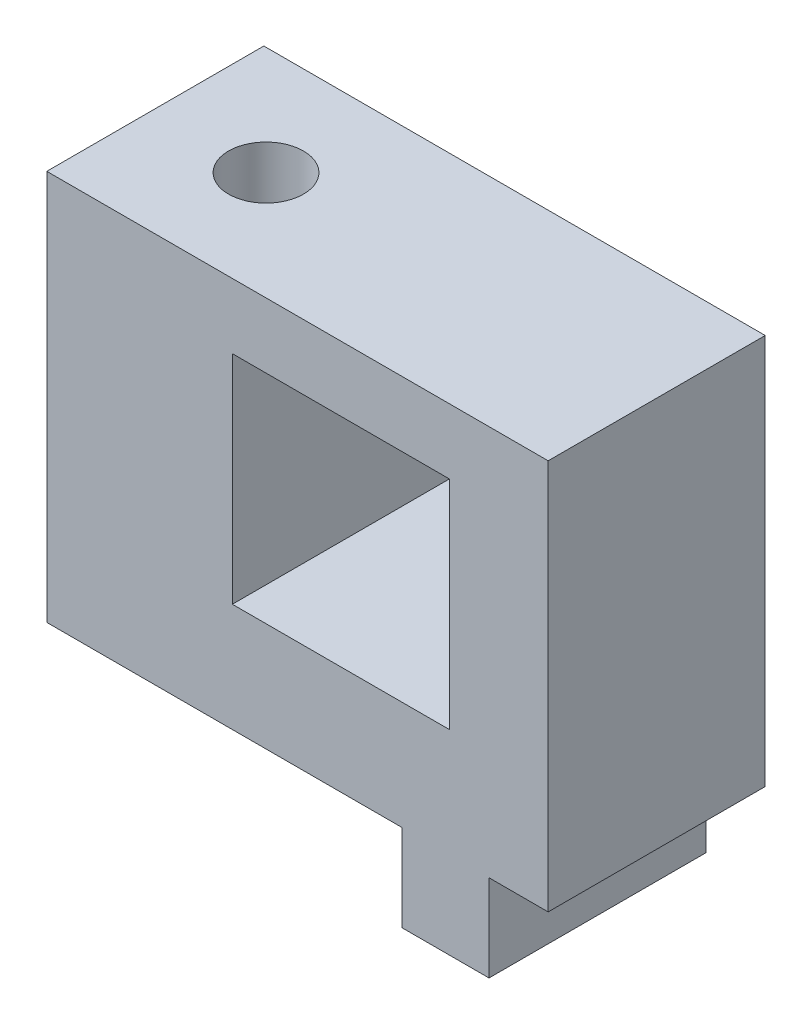
ISO-10303-21;
HEADER;
FILE_DESCRIPTION(('STEP AP214'),'2;1');
FILE_NAME('part.step','',(''),(''),'','','');
FILE_SCHEMA(('AUTOMOTIVE_DESIGN { 1 0 10303 214 1 1 1 1 }'));
ENDSEC;
DATA;
#1=APPLICATION_CONTEXT('core data for automotive mechanical design processes');
#2=APPLICATION_PROTOCOL_DEFINITION('international standard','automotive_design',2000,#1);
#3=PRODUCT_CONTEXT('',#1,'mechanical');
#4=PRODUCT('Part','Part','',(#3));
#5=PRODUCT_RELATED_PRODUCT_CATEGORY('part','',(#4));
#6=PRODUCT_DEFINITION_FORMATION('','',#4);
#7=PRODUCT_DEFINITION_CONTEXT('part definition',#1,'design');
#8=PRODUCT_DEFINITION('design','',#6,#7);
#9=PRODUCT_DEFINITION_SHAPE('','',#8);
#10=(LENGTH_UNIT() NAMED_UNIT(*) SI_UNIT(.MILLI.,.METRE.));
#11=(NAMED_UNIT(*) PLANE_ANGLE_UNIT() SI_UNIT($,.RADIAN.));
#12=(NAMED_UNIT(*) SI_UNIT($,.STERADIAN.) SOLID_ANGLE_UNIT());
#13=UNCERTAINTY_MEASURE_WITH_UNIT(LENGTH_MEASURE(1.E-05),#10,'distance_accuracy_value','');
#14=(GEOMETRIC_REPRESENTATION_CONTEXT(3) GLOBAL_UNCERTAINTY_ASSIGNED_CONTEXT((#13)) GLOBAL_UNIT_ASSIGNED_CONTEXT((#10,
#11,#12)) REPRESENTATION_CONTEXT('',''));
#15=CARTESIAN_POINT('',(0.,0.,0.));
#16=DIRECTION('',(0.,0.,1.));
#17=DIRECTION('',(1.,0.,0.));
#18=AXIS2_PLACEMENT_3D('',#15,#16,#17);
#19=CARTESIAN_POINT('',(64.7817724493501,-48.7352540953182,331.800000190735));
#20=DIRECTION('',(1.,0.,0.));
#21=DIRECTION('',(0.,1.,0.));
#22=AXIS2_PLACEMENT_3D('',#19,#20,#21);
#23=PLANE('',#22);
#24=DIRECTION('',(0.,0.,1.));
#25=VECTOR('',#24,1.);
#26=CARTESIAN_POINT('',(64.7817724493499,-46.8352426512264,331.800000190735));
#27=LINE('',#26,#25);
#28=CARTESIAN_POINT('',(64.7817724493501,-46.8352426512264,326.800000190735));
#29=VERTEX_POINT('',#28);
#30=CARTESIAN_POINT('',(64.7817724493501,-46.8352350218319,336.800000190735));
#31=VERTEX_POINT('',#30);
#32=EDGE_CURVE('E144',#29,#31,#27,.T.);
#33=ORIENTED_EDGE('',*,*,#32,.F.);
#34=DIRECTION('',(0.,1.,0.));
#35=VECTOR('',#34,1.);
#36=CARTESIAN_POINT('',(64.7817724493501,-46.535244558575,326.800000190735));
#37=LINE('',#36,#35);
#38=CARTESIAN_POINT('',(64.7817724493501,-50.8352540953182,326.800000190735));
#39=VERTEX_POINT('',#38);
#40=EDGE_CURVE('E35',#39,#29,#37,.T.);
#41=ORIENTED_EDGE('',*,*,#40,.F.);
#42=DIRECTION('',(0.,0.,-1.));
#43=VECTOR('',#42,1.);
#44=CARTESIAN_POINT('',(64.7817724493502,-50.8352540953182,331.800000190735));
#45=LINE('',#44,#43);
#46=CARTESIAN_POINT('',(64.7817724493501,-50.8352540953182,336.800000190735));
#47=VERTEX_POINT('',#46);
#48=EDGE_CURVE('E217',#47,#39,#45,.T.);
#49=ORIENTED_EDGE('',*,*,#48,.F.);
#50=DIRECTION('',(0.,1.,0.));
#51=VECTOR('',#50,1.);
#52=CARTESIAN_POINT('',(64.7817724493501,-46.535244558575,336.800000190735));
#53=LINE('',#52,#51);
#54=EDGE_CURVE('E11',#47,#31,#53,.T.);
#55=ORIENTED_EDGE('',*,*,#54,.T.);
#56=EDGE_LOOP('',(#33,#41,#49,#55));
#57=FACE_BOUND('',#56,.T.);
#58=ADVANCED_FACE('F16',(#57),#23,.F.);
#59=CARTESIAN_POINT('',(68.7817724493501,-48.7352540953182,331.800000190735));
#60=DIRECTION('',(-1.,0.,0.));
#61=DIRECTION('',(0.,-1.,0.));
#62=AXIS2_PLACEMENT_3D('',#59,#60,#61);
#63=PLANE('',#62);
#64=DIRECTION('',(0.,0.,-1.));
#65=VECTOR('',#64,1.);
#66=CARTESIAN_POINT('',(68.7817724493503,-46.8352426512264,331.800000190735));
#67=LINE('',#66,#65);
#68=CARTESIAN_POINT('',(68.7817724493501,-46.8352350218319,336.800000190735));
#69=VERTEX_POINT('',#68);
#70=CARTESIAN_POINT('',(68.7817724493501,-46.8352426512264,326.800000190735));
#71=VERTEX_POINT('',#70);
#72=EDGE_CURVE('E157',#69,#71,#67,.T.);
#73=ORIENTED_EDGE('',*,*,#72,.F.);
#74=DIRECTION('',(0.,1.,0.));
#75=VECTOR('',#74,1.);
#76=CARTESIAN_POINT('',(68.7817724493501,-46.535244558575,336.800000190735));
#77=LINE('',#76,#75);
#78=CARTESIAN_POINT('',(68.7817724493501,-50.8352540953182,336.800000190735));
#79=VERTEX_POINT('',#78);
#80=EDGE_CURVE('E141',#79,#69,#77,.T.);
#81=ORIENTED_EDGE('',*,*,#80,.F.);
#82=DIRECTION('',(0.,0.,1.));
#83=VECTOR('',#82,1.);
#84=CARTESIAN_POINT('',(68.78177244935,-50.8352540953182,331.800000190735));
#85=LINE('',#84,#83);
#86=CARTESIAN_POINT('',(68.7817724493501,-50.8352540953182,326.800000190735));
#87=VERTEX_POINT('',#86);
#88=EDGE_CURVE('E140',#87,#79,#85,.T.);
#89=ORIENTED_EDGE('',*,*,#88,.F.);
#90=DIRECTION('',(0.,1.,0.));
#91=VECTOR('',#90,1.);
#92=CARTESIAN_POINT('',(68.7817724493501,-46.535244558575,326.800000190735));
#93=LINE('',#92,#91);
#94=EDGE_CURVE('E26',#87,#71,#93,.T.);
#95=ORIENTED_EDGE('',*,*,#94,.T.);
#96=EDGE_LOOP('',(#73,#81,#89,#95));
#97=FACE_BOUND('',#96,.T.);
#98=ADVANCED_FACE('F230',(#97),#63,.F.);
#99=CARTESIAN_POINT('',(65.5067724493501,-50.8352540953182,331.800000190735));
#100=DIRECTION('',(0.,-1.,0.));
#101=DIRECTION('',(0.,0.,1.));
#102=AXIS2_PLACEMENT_3D('',#99,#100,#101);
#103=PLANE('',#102);
#104=DIRECTION('',(-1.,0.,0.));
#105=VECTOR('',#104,1.);
#106=CARTESIAN_POINT('',(65.5067724493501,-50.8352540953182,336.800000190735));
#107=LINE('',#106,#105);
#108=EDGE_CURVE('E210',#79,#47,#107,.T.);
#109=ORIENTED_EDGE('',*,*,#108,.T.);
#110=ORIENTED_EDGE('',*,*,#48,.T.);
#111=DIRECTION('',(1.,0.,0.));
#112=VECTOR('',#111,1.);
#113=CARTESIAN_POINT('',(65.5067724493501,-50.8352540953182,326.800000190735));
#114=LINE('',#113,#112);
#115=EDGE_CURVE('E208',#39,#87,#114,.T.);
#116=ORIENTED_EDGE('',*,*,#115,.T.);
#117=ORIENTED_EDGE('',*,*,#88,.T.);
#118=EDGE_LOOP('',(#109,#110,#116,#117));
#119=FACE_BOUND('',#118,.T.);
#120=ADVANCED_FACE('F216',(#119),#103,.T.);
#121=CARTESIAN_POINT('',(62.006764290576,-44.3352350218319,336.800000190735));
#122=DIRECTION('',(0.,0.,-1.));
#123=DIRECTION('',(0.,-1.,0.));
#124=AXIS2_PLACEMENT_3D('',#121,#122,#123);
#125=PLANE('',#124);
#126=DIRECTION('',(-1.,0.,0.));
#127=VECTOR('',#126,1.);
#128=CARTESIAN_POINT('',(62.006764290576,-46.8352350218319,336.800000190735));
#129=LINE('',#128,#127);
#130=CARTESIAN_POINT('',(71.5067724493502,-46.8352426512264,336.800000190735));
#131=VERTEX_POINT('',#130);
#132=EDGE_CURVE('E134',#131,#69,#129,.T.);
#133=ORIENTED_EDGE('',*,*,#132,.F.);
#134=DIRECTION('',(0.,-1.,0.));
#135=VECTOR('',#134,1.);
#136=CARTESIAN_POINT('',(71.5067724493502,-44.3352350218319,336.800000190735));
#137=LINE('',#136,#135);
#138=CARTESIAN_POINT('',(71.5067724493502,-28.8352159483455,336.800000190735));
#139=VERTEX_POINT('',#138);
#140=EDGE_CURVE('E128',#139,#131,#137,.T.);
#141=ORIENTED_EDGE('',*,*,#140,.F.);
#142=DIRECTION('',(1.,0.,0.));
#143=VECTOR('',#142,1.);
#144=CARTESIAN_POINT('',(62.006764290576,-28.8352159483455,336.800000190735));
#145=LINE('',#144,#143);
#146=CARTESIAN_POINT('',(48.406764290576,-28.8352159483455,336.800000190735));
#147=VERTEX_POINT('',#146);
#148=EDGE_CURVE('E127',#147,#139,#145,.T.);
#149=ORIENTED_EDGE('',*,*,#148,.F.);
#150=DIRECTION('',(0.,-1.,0.));
#151=VECTOR('',#150,1.);
#152=CARTESIAN_POINT('',(48.406764290576,-44.3352350218318,336.800000190735));
#153=LINE('',#152,#151);
#154=CARTESIAN_POINT('',(48.406764290576,-46.8352350218318,336.800000190735));
#155=VERTEX_POINT('',#154);
#156=EDGE_CURVE('E137',#147,#155,#153,.T.);
#157=ORIENTED_EDGE('',*,*,#156,.T.);
#158=DIRECTION('',(-1.,0.,0.));
#159=VECTOR('',#158,1.);
#160=CARTESIAN_POINT('',(62.006764290576,-46.8352350218319,336.800000190735));
#161=LINE('',#160,#159);
#162=EDGE_CURVE('E142',#31,#155,#161,.T.);
#163=ORIENTED_EDGE('',*,*,#162,.F.);
#164=ORIENTED_EDGE('',*,*,#54,.F.);
#165=ORIENTED_EDGE('',*,*,#108,.F.);
#166=ORIENTED_EDGE('',*,*,#80,.T.);
#167=EDGE_LOOP('',(#133,#141,#149,#157,#163,#164,#165,#166));
#168=FACE_BOUND('',#167,.T.);
#169=DIRECTION('',(0.,1.,0.));
#170=VECTOR('',#169,1.);
#171=CARTESIAN_POINT('',(56.9567642905759,-40.5852350218319,336.800000190735));
#172=LINE('',#171,#170);
#173=CARTESIAN_POINT('',(56.9567642905759,-41.8352350218319,336.800000190735));
#174=VERTEX_POINT('',#173);
#175=CARTESIAN_POINT('',(56.9567642905759,-31.8352350218319,336.800000190735));
#176=VERTEX_POINT('',#175);
#177=EDGE_CURVE('E146',#174,#176,#172,.T.);
#178=ORIENTED_EDGE('',*,*,#177,.T.);
#179=DIRECTION('',(1.,0.,0.));
#180=VECTOR('',#179,1.);
#181=CARTESIAN_POINT('',(61.9817642905759,-31.8352350218319,336.800000190735));
#182=LINE('',#181,#180);
#183=CARTESIAN_POINT('',(66.9567642905759,-31.8352350218319,336.800000190735));
#184=VERTEX_POINT('',#183);
#185=EDGE_CURVE('E149',#176,#184,#182,.T.);
#186=ORIENTED_EDGE('',*,*,#185,.T.);
#187=DIRECTION('',(0.,-1.,0.));
#188=VECTOR('',#187,1.);
#189=CARTESIAN_POINT('',(66.9567642905759,-40.5852350218319,336.800000190735));
#190=LINE('',#189,#188);
#191=CARTESIAN_POINT('',(66.9567642905759,-41.8352350218319,336.800000190735));
#192=VERTEX_POINT('',#191);
#193=EDGE_CURVE('E152',#184,#192,#190,.T.);
#194=ORIENTED_EDGE('',*,*,#193,.T.);
#195=DIRECTION('',(-1.,0.,0.));
#196=VECTOR('',#195,1.);
#197=CARTESIAN_POINT('',(61.9817642905759,-41.8352350218319,336.800000190735));
#198=LINE('',#197,#196);
#199=EDGE_CURVE('E155',#192,#174,#198,.T.);
#200=ORIENTED_EDGE('',*,*,#199,.T.);
#201=EDGE_LOOP('',(#178,#186,#194,#200));
#202=FACE_BOUND('',#201,.T.);
#203=ADVANCED_FACE('F197',(#168,#202),#125,.F.);
#204=CARTESIAN_POINT('',(69.0067642905761,-46.8352426512264,331.800000190735));
#205=DIRECTION('',(0.,-1.,0.));
#206=DIRECTION('',(0.,0.,1.));
#207=AXIS2_PLACEMENT_3D('',#204,#205,#206);
#208=PLANE('',#207);
#209=ORIENTED_EDGE('',*,*,#72,.T.);
#210=DIRECTION('',(1.,0.,0.));
#211=VECTOR('',#210,1.);
#212=CARTESIAN_POINT('',(65.5067642905761,-46.8352426512264,326.800000190735));
#213=LINE('',#212,#211);
#214=CARTESIAN_POINT('',(71.5067724493502,-46.8352426512264,326.800000190735));
#215=VERTEX_POINT('',#214);
#216=EDGE_CURVE('E158',#71,#215,#213,.T.);
#217=ORIENTED_EDGE('',*,*,#216,.T.);
#218=DIRECTION('',(0.,0.,1.));
#219=VECTOR('',#218,1.);
#220=CARTESIAN_POINT('',(71.5067724493502,-46.8352426512264,331.800000190735));
#221=LINE('',#220,#219);
#222=EDGE_CURVE('E121',#215,#131,#221,.T.);
#223=ORIENTED_EDGE('',*,*,#222,.T.);
#224=ORIENTED_EDGE('',*,*,#132,.T.);
#225=EDGE_LOOP('',(#209,#217,#223,#224));
#226=FACE_BOUND('',#225,.T.);
#227=ADVANCED_FACE('F204',(#226),#208,.T.);
#228=CARTESIAN_POINT('',(53.5067642905759,-45.8352540953182,331.800000190735));
#229=DIRECTION('',(0.,1.,0.));
#230=DIRECTION('',(0.,0.,-1.));
#231=AXIS2_PLACEMENT_3D('',#228,#229,#230);
#232=CYLINDRICAL_SURFACE('',#231,1.725);
#233=CARTESIAN_POINT('',(53.506764290576,-28.8352159483455,331.800000190735));
#234=DIRECTION('',(0.,-1.,0.));
#235=DIRECTION('',(0.,0.,-1.));
#236=AXIS2_PLACEMENT_3D('',#233,#234,#235);
#237=CIRCLE('',#236,1.725);
#238=CARTESIAN_POINT('',(53.506764290576,-28.8352159483455,330.075000190735));
#239=VERTEX_POINT('',#238);
#240=EDGE_CURVE('E114',#239,#239,#237,.T.);
#241=ORIENTED_EDGE('',*,*,#240,.F.);
#242=EDGE_LOOP('',(#241));
#243=FACE_BOUND('',#242,.T.);
#244=CARTESIAN_POINT('',(53.5067642905759,-46.8352426512264,331.800000190735));
#245=DIRECTION('',(0.,1.,0.));
#246=DIRECTION('',(0.,0.,-1.));
#247=AXIS2_PLACEMENT_3D('',#244,#245,#246);
#248=CIRCLE('',#247,1.725);
#249=CARTESIAN_POINT('',(53.5067642905759,-46.8352426512264,330.075000190735));
#250=VERTEX_POINT('',#249);
#251=EDGE_CURVE('E123',#250,#250,#248,.T.);
#252=ORIENTED_EDGE('',*,*,#251,.F.);
#253=EDGE_LOOP('',(#252));
#254=FACE_BOUND('',#253,.T.);
#255=ADVANCED_FACE('F244',(#243,#254),#232,.F.);
#256=CARTESIAN_POINT('',(66.9567642905759,-36.8352350218319,331.300000190735));
#257=DIRECTION('',(-1.,0.,0.));
#258=DIRECTION('',(0.,0.,1.));
#259=AXIS2_PLACEMENT_3D('',#256,#257,#258);
#260=PLANE('',#259);
#261=ORIENTED_EDGE('',*,*,#193,.F.);
#262=DIRECTION('',(0.,0.,1.));
#263=VECTOR('',#262,1.);
#264=CARTESIAN_POINT('',(66.9567642905759,-31.8352350218319,331.300000190735));
#265=LINE('',#264,#263);
#266=CARTESIAN_POINT('',(66.9567642905759,-31.8352350218319,326.800000190735));
#267=VERTEX_POINT('',#266);
#268=EDGE_CURVE('E167',#267,#184,#265,.T.);
#269=ORIENTED_EDGE('',*,*,#268,.F.);
#270=DIRECTION('',(0.,1.,0.));
#271=VECTOR('',#270,1.);
#272=CARTESIAN_POINT('',(66.9567642905759,-40.5852350218319,326.800000190735));
#273=LINE('',#272,#271);
#274=CARTESIAN_POINT('',(66.9567642905759,-41.8352350218319,326.800000190735));
#275=VERTEX_POINT('',#274);
#276=EDGE_CURVE('E171',#275,#267,#273,.T.);
#277=ORIENTED_EDGE('',*,*,#276,.F.);
#278=DIRECTION('',(0.,0.,1.));
#279=VECTOR('',#278,1.);
#280=CARTESIAN_POINT('',(66.9567642905759,-41.8352350218319,331.300000190735));
#281=LINE('',#280,#279);
#282=EDGE_CURVE('E174',#275,#192,#281,.T.);
#283=ORIENTED_EDGE('',*,*,#282,.T.);
#284=EDGE_LOOP('',(#261,#269,#277,#283));
#285=FACE_BOUND('',#284,.T.);
#286=ADVANCED_FACE('F247',(#285),#260,.T.);
#287=CARTESIAN_POINT('',(61.9567642905759,-41.8352350218319,331.300000190735));
#288=DIRECTION('',(0.,1.,0.));
#289=DIRECTION('',(0.,0.,1.));
#290=AXIS2_PLACEMENT_3D('',#287,#288,#289);
#291=PLANE('',#290);
#292=ORIENTED_EDGE('',*,*,#199,.F.);
#293=ORIENTED_EDGE('',*,*,#282,.F.);
#294=DIRECTION('',(1.,0.,0.));
#295=VECTOR('',#294,1.);
#296=CARTESIAN_POINT('',(61.9817642905759,-41.8352350218319,326.800000190735));
#297=LINE('',#296,#295);
#298=CARTESIAN_POINT('',(56.9567642905759,-41.8352350218319,326.800000190735));
#299=VERTEX_POINT('',#298);
#300=EDGE_CURVE('E173',#299,#275,#297,.T.);
#301=ORIENTED_EDGE('',*,*,#300,.F.);
#302=DIRECTION('',(0.,0.,1.));
#303=VECTOR('',#302,1.);
#304=CARTESIAN_POINT('',(56.9567642905759,-41.8352350218319,331.300000190735));
#305=LINE('',#304,#303);
#306=EDGE_CURVE('E177',#299,#174,#305,.T.);
#307=ORIENTED_EDGE('',*,*,#306,.T.);
#308=EDGE_LOOP('',(#292,#293,#301,#307));
#309=FACE_BOUND('',#308,.T.);
#310=ADVANCED_FACE('F251',(#309),#291,.T.);
#311=CARTESIAN_POINT('',(56.9567642905759,-36.8352350218319,331.300000190735));
#312=DIRECTION('',(1.,0.,0.));
#313=DIRECTION('',(0.,0.,-1.));
#314=AXIS2_PLACEMENT_3D('',#311,#312,#313);
#315=PLANE('',#314);
#316=ORIENTED_EDGE('',*,*,#177,.F.);
#317=ORIENTED_EDGE('',*,*,#306,.F.);
#318=DIRECTION('',(0.,-1.,0.));
#319=VECTOR('',#318,1.);
#320=CARTESIAN_POINT('',(56.9567642905759,-40.5852350218319,326.800000190735));
#321=LINE('',#320,#319);
#322=CARTESIAN_POINT('',(56.9567642905759,-31.8352350218319,326.800000190735));
#323=VERTEX_POINT('',#322);
#324=EDGE_CURVE('E180',#323,#299,#321,.T.);
#325=ORIENTED_EDGE('',*,*,#324,.F.);
#326=DIRECTION('',(0.,0.,1.));
#327=VECTOR('',#326,1.);
#328=CARTESIAN_POINT('',(56.9567642905759,-31.8352350218319,331.300000190735));
#329=LINE('',#328,#327);
#330=EDGE_CURVE('E170',#323,#176,#329,.T.);
#331=ORIENTED_EDGE('',*,*,#330,.T.);
#332=EDGE_LOOP('',(#316,#317,#325,#331));
#333=FACE_BOUND('',#332,.T.);
#334=ADVANCED_FACE('F255',(#333),#315,.T.);
#335=CARTESIAN_POINT('',(61.9567642905759,-31.8352350218319,331.300000190735));
#336=DIRECTION('',(0.,-1.,0.));
#337=DIRECTION('',(0.,0.,-1.));
#338=AXIS2_PLACEMENT_3D('',#335,#336,#337);
#339=PLANE('',#338);
#340=ORIENTED_EDGE('',*,*,#185,.F.);
#341=ORIENTED_EDGE('',*,*,#330,.F.);
#342=DIRECTION('',(-1.,0.,0.));
#343=VECTOR('',#342,1.);
#344=CARTESIAN_POINT('',(61.9817642905759,-31.8352350218319,326.800000190735));
#345=LINE('',#344,#343);
#346=EDGE_CURVE('E163',#267,#323,#345,.T.);
#347=ORIENTED_EDGE('',*,*,#346,.F.);
#348=ORIENTED_EDGE('',*,*,#268,.T.);
#349=EDGE_LOOP('',(#340,#341,#347,#348));
#350=FACE_BOUND('',#349,.T.);
#351=ADVANCED_FACE('F259',(#350),#339,.T.);
#352=CARTESIAN_POINT('',(69.0067642905761,-46.8352426512264,331.800000190735));
#353=DIRECTION('',(0.,-1.,0.));
#354=DIRECTION('',(0.,0.,1.));
#355=AXIS2_PLACEMENT_3D('',#352,#353,#354);
#356=PLANE('',#355);
#357=ORIENTED_EDGE('',*,*,#32,.T.);
#358=ORIENTED_EDGE('',*,*,#162,.T.);
#359=DIRECTION('',(0.,0.,-1.));
#360=VECTOR('',#359,1.);
#361=CARTESIAN_POINT('',(48.406764290576,-46.8352350218318,331.800000190735));
#362=LINE('',#361,#360);
#363=CARTESIAN_POINT('',(48.406764290576,-46.8352350218318,326.800000190735));
#364=VERTEX_POINT('',#363);
#365=EDGE_CURVE('E145',#155,#364,#362,.T.);
#366=ORIENTED_EDGE('',*,*,#365,.T.);
#367=DIRECTION('',(1.,0.,0.));
#368=VECTOR('',#367,1.);
#369=CARTESIAN_POINT('',(65.5067642905761,-46.8352426512264,326.800000190735));
#370=LINE('',#369,#368);
#371=EDGE_CURVE('E166',#364,#29,#370,.T.);
#372=ORIENTED_EDGE('',*,*,#371,.T.);
#373=EDGE_LOOP('',(#357,#358,#366,#372));
#374=FACE_BOUND('',#373,.T.);
#375=ORIENTED_EDGE('',*,*,#251,.T.);
#376=EDGE_LOOP('',(#375));
#377=FACE_BOUND('',#376,.T.);
#378=ADVANCED_FACE('F226',(#374,#377),#356,.T.);
#379=CARTESIAN_POINT('',(62.006764290576,-44.3352350218319,326.800000190735));
#380=DIRECTION('',(0.,0.,1.));
#381=DIRECTION('',(0.,1.,0.));
#382=AXIS2_PLACEMENT_3D('',#379,#380,#381);
#383=PLANE('',#382);
#384=ORIENTED_EDGE('',*,*,#371,.F.);
#385=DIRECTION('',(0.,-1.,0.));
#386=VECTOR('',#385,1.);
#387=CARTESIAN_POINT('',(48.406764290576,-44.3352350218318,326.800000190735));
#388=LINE('',#387,#386);
#389=CARTESIAN_POINT('',(48.406764290576,-28.8352159483455,326.800000190735));
#390=VERTEX_POINT('',#389);
#391=EDGE_CURVE('E101',#390,#364,#388,.T.);
#392=ORIENTED_EDGE('',*,*,#391,.F.);
#393=DIRECTION('',(-1.,0.,0.));
#394=VECTOR('',#393,1.);
#395=CARTESIAN_POINT('',(62.006764290576,-28.8352159483455,326.800000190735));
#396=LINE('',#395,#394);
#397=CARTESIAN_POINT('',(71.5067724493502,-28.8352159483455,326.800000190735));
#398=VERTEX_POINT('',#397);
#399=EDGE_CURVE('E104',#398,#390,#396,.T.);
#400=ORIENTED_EDGE('',*,*,#399,.F.);
#401=DIRECTION('',(0.,-1.,0.));
#402=VECTOR('',#401,1.);
#403=CARTESIAN_POINT('',(71.5067724493502,-44.3352350218319,326.800000190735));
#404=LINE('',#403,#402);
#405=EDGE_CURVE('E109',#398,#215,#404,.T.);
#406=ORIENTED_EDGE('',*,*,#405,.T.);
#407=ORIENTED_EDGE('',*,*,#216,.F.);
#408=ORIENTED_EDGE('',*,*,#94,.F.);
#409=ORIENTED_EDGE('',*,*,#115,.F.);
#410=ORIENTED_EDGE('',*,*,#40,.T.);
#411=EDGE_LOOP('',(#384,#392,#400,#406,#407,#408,#409,#410));
#412=FACE_BOUND('',#411,.T.);
#413=ORIENTED_EDGE('',*,*,#324,.T.);
#414=ORIENTED_EDGE('',*,*,#300,.T.);
#415=ORIENTED_EDGE('',*,*,#276,.T.);
#416=ORIENTED_EDGE('',*,*,#346,.T.);
#417=EDGE_LOOP('',(#413,#414,#415,#416));
#418=FACE_BOUND('',#417,.T.);
#419=ADVANCED_FACE('F106',(#412,#418),#383,.F.);
#420=CARTESIAN_POINT('',(62.006764290576,-28.8352159483455,331.800000190735));
#421=DIRECTION('',(0.,1.,0.));
#422=DIRECTION('',(0.,0.,-1.));
#423=AXIS2_PLACEMENT_3D('',#420,#421,#422);
#424=PLANE('',#423);
#425=ORIENTED_EDGE('',*,*,#240,.T.);
#426=EDGE_LOOP('',(#425));
#427=FACE_BOUND('',#426,.T.);
#428=ORIENTED_EDGE('',*,*,#399,.T.);
#429=DIRECTION('',(0.,0.,1.));
#430=VECTOR('',#429,1.);
#431=CARTESIAN_POINT('',(48.406764290576,-28.8352159483455,331.800000190735));
#432=LINE('',#431,#430);
#433=EDGE_CURVE('E115',#390,#147,#432,.T.);
#434=ORIENTED_EDGE('',*,*,#433,.T.);
#435=ORIENTED_EDGE('',*,*,#148,.T.);
#436=DIRECTION('',(0.,0.,-1.));
#437=VECTOR('',#436,1.);
#438=CARTESIAN_POINT('',(71.5067724493502,-28.8352159483455,331.800000190735));
#439=LINE('',#438,#437);
#440=EDGE_CURVE('E20',#139,#398,#439,.T.);
#441=ORIENTED_EDGE('',*,*,#440,.T.);
#442=EDGE_LOOP('',(#428,#434,#435,#441));
#443=FACE_BOUND('',#442,.T.);
#444=ADVANCED_FACE('F126',(#427,#443),#424,.T.);
#445=CARTESIAN_POINT('',(71.5067724493502,-44.3352350218319,331.800000190735));
#446=DIRECTION('',(-1.,0.,0.));
#447=DIRECTION('',(0.,1.,0.));
#448=AXIS2_PLACEMENT_3D('',#445,#446,#447);
#449=PLANE('',#448);
#450=ORIENTED_EDGE('',*,*,#405,.F.);
#451=ORIENTED_EDGE('',*,*,#440,.F.);
#452=ORIENTED_EDGE('',*,*,#140,.T.);
#453=ORIENTED_EDGE('',*,*,#222,.F.);
#454=EDGE_LOOP('',(#450,#451,#452,#453));
#455=FACE_BOUND('',#454,.T.);
#456=ADVANCED_FACE('F119',(#455),#449,.F.);
#457=CARTESIAN_POINT('',(48.406764290576,-44.3352350218318,331.800000190735));
#458=DIRECTION('',(1.,0.,0.));
#459=DIRECTION('',(0.,-1.,0.));
#460=AXIS2_PLACEMENT_3D('',#457,#458,#459);
#461=PLANE('',#460);
#462=ORIENTED_EDGE('',*,*,#391,.T.);
#463=ORIENTED_EDGE('',*,*,#365,.F.);
#464=ORIENTED_EDGE('',*,*,#156,.F.);
#465=ORIENTED_EDGE('',*,*,#433,.F.);
#466=EDGE_LOOP('',(#462,#463,#464,#465));
#467=FACE_BOUND('',#466,.T.);
#468=ADVANCED_FACE('F18',(#467),#461,.F.);
#469=CLOSED_SHELL('',(#58,#98,#120,#203,#227,#255,#286,#310,#334,#351,#378,#419,#444,#456,#468));
#470=MANIFOLD_SOLID_BREP('B1',#469);
#471=ADVANCED_BREP_SHAPE_REPRESENTATION('',(#18,#470),#14);
#472=SHAPE_DEFINITION_REPRESENTATION(#9,#471);
ENDSEC;
END-ISO-10303-21;
